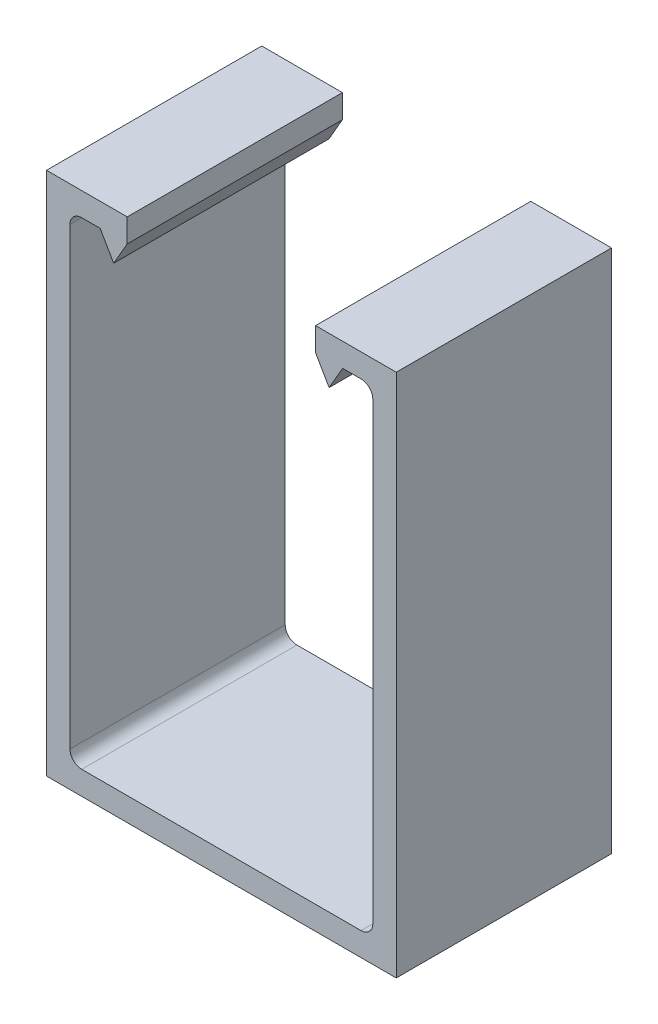
ISO-10303-21;
HEADER;
FILE_DESCRIPTION(('STEP AP214'),'2;1');
FILE_NAME('part.step','',(''),(''),'','','');
FILE_SCHEMA(('AUTOMOTIVE_DESIGN { 1 0 10303 214 1 1 1 1 }'));
ENDSEC;
DATA;
#1=APPLICATION_CONTEXT('core data for automotive mechanical design processes');
#2=APPLICATION_PROTOCOL_DEFINITION('international standard','automotive_design',2000,#1);
#3=PRODUCT_CONTEXT('',#1,'mechanical');
#4=PRODUCT('Part','Part','',(#3));
#5=PRODUCT_RELATED_PRODUCT_CATEGORY('part','',(#4));
#6=PRODUCT_DEFINITION_FORMATION('','',#4);
#7=PRODUCT_DEFINITION_CONTEXT('part definition',#1,'design');
#8=PRODUCT_DEFINITION('design','',#6,#7);
#9=PRODUCT_DEFINITION_SHAPE('','',#8);
#10=(LENGTH_UNIT() NAMED_UNIT(*) SI_UNIT(.MILLI.,.METRE.));
#11=(NAMED_UNIT(*) PLANE_ANGLE_UNIT() SI_UNIT($,.RADIAN.));
#12=(NAMED_UNIT(*) SI_UNIT($,.STERADIAN.) SOLID_ANGLE_UNIT());
#13=UNCERTAINTY_MEASURE_WITH_UNIT(LENGTH_MEASURE(1.E-05),#10,'distance_accuracy_value','');
#14=(GEOMETRIC_REPRESENTATION_CONTEXT(3) GLOBAL_UNCERTAINTY_ASSIGNED_CONTEXT((#13)) GLOBAL_UNIT_ASSIGNED_CONTEXT((#10,
#11,#12)) REPRESENTATION_CONTEXT('',''));
#15=CARTESIAN_POINT('',(0.,0.,0.));
#16=DIRECTION('',(0.,0.,1.));
#17=DIRECTION('',(1.,0.,0.));
#18=AXIS2_PLACEMENT_3D('',#15,#16,#17);
#19=CARTESIAN_POINT('',(-16.4846,-26.80335,12.7));
#20=DIRECTION('',(0.,0.,-1.));
#21=DIRECTION('',(-1.,0.,0.));
#22=AXIS2_PLACEMENT_3D('',#19,#20,#21);
#23=CYLINDRICAL_SURFACE('',#22,1.3843);
#24=CARTESIAN_POINT('',(-16.4846,-26.80335,-12.7));
#25=DIRECTION('',(0.,0.,-1.));
#26=DIRECTION('',(1.,0.,0.));
#27=AXIS2_PLACEMENT_3D('',#24,#25,#26);
#28=CIRCLE('',#27,1.3843);
#29=CARTESIAN_POINT('',(-16.4846,-28.18765,-12.7));
#30=VERTEX_POINT('',#29);
#31=CARTESIAN_POINT('',(-17.8689,-26.80335,-12.7));
#32=VERTEX_POINT('',#31);
#33=EDGE_CURVE('E200',#30,#32,#28,.T.);
#34=ORIENTED_EDGE('',*,*,#33,.T.);
#35=DIRECTION('',(0.,0.,-1.));
#36=VECTOR('',#35,1.);
#37=CARTESIAN_POINT('',(-17.8689,-26.80335,12.7));
#38=LINE('',#37,#36);
#39=CARTESIAN_POINT('',(-17.8689,-26.80335,12.7));
#40=VERTEX_POINT('',#39);
#41=EDGE_CURVE('E11',#40,#32,#38,.T.);
#42=ORIENTED_EDGE('',*,*,#41,.F.);
#43=CARTESIAN_POINT('',(-16.4846,-26.80335,12.7));
#44=DIRECTION('',(0.,0.,-1.));
#45=DIRECTION('',(1.,0.,0.));
#46=AXIS2_PLACEMENT_3D('',#43,#44,#45);
#47=CIRCLE('',#46,1.3843);
#48=CARTESIAN_POINT('',(-16.4846,-28.18765,12.7));
#49=VERTEX_POINT('',#48);
#50=EDGE_CURVE('E238',#49,#40,#47,.T.);
#51=ORIENTED_EDGE('',*,*,#50,.F.);
#52=DIRECTION('',(0.,0.,-1.));
#53=VECTOR('',#52,1.);
#54=CARTESIAN_POINT('',(-16.4846,-28.18765,12.7));
#55=LINE('',#54,#53);
#56=EDGE_CURVE('E196',#49,#30,#55,.T.);
#57=ORIENTED_EDGE('',*,*,#56,.T.);
#58=EDGE_LOOP('',(#34,#42,#51,#57));
#59=FACE_BOUND('',#58,.T.);
#60=ADVANCED_FACE('F32',(#59),#23,.F.);
#61=CARTESIAN_POINT('',(-17.8689,26.80335,12.7));
#62=DIRECTION('',(-1.,0.,0.));
#63=DIRECTION('',(0.,0.,1.));
#64=AXIS2_PLACEMENT_3D('',#61,#62,#63);
#65=PLANE('',#64);
#66=DIRECTION('',(0.,1.,0.));
#67=VECTOR('',#66,1.);
#68=CARTESIAN_POINT('',(-17.8689,26.80335,-12.7));
#69=LINE('',#68,#67);
#70=CARTESIAN_POINT('',(-17.8689,26.80335,-12.7));
#71=VERTEX_POINT('',#70);
#72=EDGE_CURVE('E203',#32,#71,#69,.T.);
#73=ORIENTED_EDGE('',*,*,#72,.T.);
#74=DIRECTION('',(0.,0.,-1.));
#75=VECTOR('',#74,1.);
#76=CARTESIAN_POINT('',(-17.8689,26.80335,12.7));
#77=LINE('',#76,#75);
#78=CARTESIAN_POINT('',(-17.8689,26.80335,12.7));
#79=VERTEX_POINT('',#78);
#80=EDGE_CURVE('E40',#79,#71,#77,.T.);
#81=ORIENTED_EDGE('',*,*,#80,.F.);
#82=DIRECTION('',(0.,1.,0.));
#83=VECTOR('',#82,1.);
#84=CARTESIAN_POINT('',(-17.8689,26.80335,12.7));
#85=LINE('',#84,#83);
#86=EDGE_CURVE('E127',#40,#79,#85,.T.);
#87=ORIENTED_EDGE('',*,*,#86,.F.);
#88=ORIENTED_EDGE('',*,*,#41,.T.);
#89=EDGE_LOOP('',(#73,#81,#87,#88));
#90=FACE_BOUND('',#89,.T.);
#91=ADVANCED_FACE('F356',(#90),#65,.F.);
#92=CARTESIAN_POINT('',(-16.4846,26.80335,12.7));
#93=DIRECTION('',(0.,0.,-1.));
#94=DIRECTION('',(-1.,0.,0.));
#95=AXIS2_PLACEMENT_3D('',#92,#93,#94);
#96=CYLINDRICAL_SURFACE('',#95,1.3843);
#97=CARTESIAN_POINT('',(-16.4846,26.80335,-12.7));
#98=DIRECTION('',(0.,0.,-1.));
#99=DIRECTION('',(1.,0.,0.));
#100=AXIS2_PLACEMENT_3D('',#97,#98,#99);
#101=CIRCLE('',#100,1.3843);
#102=CARTESIAN_POINT('',(-16.4846,28.18765,-12.7));
#103=VERTEX_POINT('',#102);
#104=EDGE_CURVE('E205',#71,#103,#101,.T.);
#105=ORIENTED_EDGE('',*,*,#104,.T.);
#106=DIRECTION('',(0.,0.,-1.));
#107=VECTOR('',#106,1.);
#108=CARTESIAN_POINT('',(-16.4846,28.18765,12.7));
#109=LINE('',#108,#107);
#110=CARTESIAN_POINT('',(-16.4846,28.18765,12.7));
#111=VERTEX_POINT('',#110);
#112=EDGE_CURVE('E281',#111,#103,#109,.T.);
#113=ORIENTED_EDGE('',*,*,#112,.F.);
#114=CARTESIAN_POINT('',(-16.4846,26.80335,12.7));
#115=DIRECTION('',(0.,0.,-1.));
#116=DIRECTION('',(1.,0.,0.));
#117=AXIS2_PLACEMENT_3D('',#114,#115,#116);
#118=CIRCLE('',#117,1.3843);
#119=EDGE_CURVE('E289',#79,#111,#118,.T.);
#120=ORIENTED_EDGE('',*,*,#119,.F.);
#121=ORIENTED_EDGE('',*,*,#80,.T.);
#122=EDGE_LOOP('',(#105,#113,#120,#121));
#123=FACE_BOUND('',#122,.T.);
#124=ADVANCED_FACE('F287',(#123),#96,.F.);
#125=CARTESIAN_POINT('',(-14.3094039105567,28.18765,12.7));
#126=DIRECTION('',(0.,1.,0.));
#127=DIRECTION('',(0.,0.,1.));
#128=AXIS2_PLACEMENT_3D('',#125,#126,#127);
#129=PLANE('',#128);
#130=DIRECTION('',(1.,0.,0.));
#131=VECTOR('',#130,1.);
#132=CARTESIAN_POINT('',(-14.3094039105567,28.18765,-12.7));
#133=LINE('',#132,#131);
#134=CARTESIAN_POINT('',(-14.3094039105567,28.18765,-12.7));
#135=VERTEX_POINT('',#134);
#136=EDGE_CURVE('E207',#103,#135,#133,.T.);
#137=ORIENTED_EDGE('',*,*,#136,.T.);
#138=DIRECTION('',(0.,0.,-1.));
#139=VECTOR('',#138,1.);
#140=CARTESIAN_POINT('',(-14.3094039105567,28.18765,12.7));
#141=LINE('',#140,#139);
#142=CARTESIAN_POINT('',(-14.3094039105567,28.18765,12.7));
#143=VERTEX_POINT('',#142);
#144=EDGE_CURVE('E278',#143,#135,#141,.T.);
#145=ORIENTED_EDGE('',*,*,#144,.F.);
#146=DIRECTION('',(1.,0.,0.));
#147=VECTOR('',#146,1.);
#148=CARTESIAN_POINT('',(-14.3094039105567,28.18765,12.7));
#149=LINE('',#148,#147);
#150=EDGE_CURVE('E307',#111,#143,#149,.T.);
#151=ORIENTED_EDGE('',*,*,#150,.F.);
#152=ORIENTED_EDGE('',*,*,#112,.T.);
#153=EDGE_LOOP('',(#137,#145,#151,#152));
#154=FACE_BOUND('',#153,.T.);
#155=ADVANCED_FACE('F298',(#154),#129,.F.);
#156=CARTESIAN_POINT('',(-14.3094039105567,28.18765,12.7));
#157=DIRECTION('',(0.866025404088336,0.499999999473635,0.));
#158=DIRECTION('',(-0.499999999473635,0.866025404088336,0.));
#159=AXIS2_PLACEMENT_3D('',#156,#157,#158);
#160=PLANE('',#159);
#161=DIRECTION('',(0.499999999473635,-0.866025404088336,0.));
#162=VECTOR('',#161,1.);
#163=CARTESIAN_POINT('',(-14.3094039105567,28.18765,-12.7));
#164=LINE('',#163,#162);
#165=CARTESIAN_POINT('',(-12.710951957522,25.41905,-12.7));
#166=VERTEX_POINT('',#165);
#167=EDGE_CURVE('E209',#135,#166,#164,.T.);
#168=ORIENTED_EDGE('',*,*,#167,.T.);
#169=DIRECTION('',(0.,0.,-1.));
#170=VECTOR('',#169,1.);
#171=CARTESIAN_POINT('',(-12.710951957522,25.41905,12.7));
#172=LINE('',#171,#170);
#173=CARTESIAN_POINT('',(-12.710951957522,25.41905,12.7));
#174=VERTEX_POINT('',#173);
#175=EDGE_CURVE('E275',#174,#166,#172,.T.);
#176=ORIENTED_EDGE('',*,*,#175,.F.);
#177=DIRECTION('',(0.499999999473635,-0.866025404088336,0.));
#178=VECTOR('',#177,1.);
#179=CARTESIAN_POINT('',(-14.3094039105567,28.18765,12.7));
#180=LINE('',#179,#178);
#181=EDGE_CURVE('E304',#143,#174,#180,.T.);
#182=ORIENTED_EDGE('',*,*,#181,.F.);
#183=ORIENTED_EDGE('',*,*,#144,.T.);
#184=EDGE_LOOP('',(#168,#176,#182,#183));
#185=FACE_BOUND('',#184,.T.);
#186=ADVANCED_FACE('F302',(#185),#160,.F.);
#187=CARTESIAN_POINT('',(-12.710951957522,25.41905,12.7));
#188=DIRECTION('',(-0.866025403480547,0.500000000526357,0.));
#189=DIRECTION('',(-0.500000000526357,-0.866025403480547,0.));
#190=AXIS2_PLACEMENT_3D('',#187,#188,#189);
#191=PLANE('',#190);
#192=DIRECTION('',(0.500000000526357,0.866025403480546,0.));
#193=VECTOR('',#192,1.);
#194=CARTESIAN_POINT('',(-12.710951957522,25.41905,-12.7));
#195=LINE('',#194,#193);
#196=CARTESIAN_POINT('',(-11.1125,28.18765,-12.7));
#197=VERTEX_POINT('',#196);
#198=EDGE_CURVE('E211',#166,#197,#195,.T.);
#199=ORIENTED_EDGE('',*,*,#198,.T.);
#200=DIRECTION('',(0.,0.,-1.));
#201=VECTOR('',#200,1.);
#202=CARTESIAN_POINT('',(-11.1125,28.18765,12.7));
#203=LINE('',#202,#201);
#204=CARTESIAN_POINT('',(-11.1125,28.18765,12.7));
#205=VERTEX_POINT('',#204);
#206=EDGE_CURVE('E272',#205,#197,#203,.T.);
#207=ORIENTED_EDGE('',*,*,#206,.F.);
#208=DIRECTION('',(0.500000000526357,0.866025403480546,0.));
#209=VECTOR('',#208,1.);
#210=CARTESIAN_POINT('',(-12.710951957522,25.41905,12.7));
#211=LINE('',#210,#209);
#212=EDGE_CURVE('E306',#174,#205,#211,.T.);
#213=ORIENTED_EDGE('',*,*,#212,.F.);
#214=ORIENTED_EDGE('',*,*,#175,.T.);
#215=EDGE_LOOP('',(#199,#207,#213,#214));
#216=FACE_BOUND('',#215,.T.);
#217=ADVANCED_FACE('F369',(#216),#191,.F.);
#218=CARTESIAN_POINT('',(-11.1125,28.18765,12.7));
#219=DIRECTION('',(-1.,0.,0.));
#220=DIRECTION('',(0.,-1.,0.));
#221=AXIS2_PLACEMENT_3D('',#218,#219,#220);
#222=PLANE('',#221);
#223=DIRECTION('',(0.,1.,0.));
#224=VECTOR('',#223,1.);
#225=CARTESIAN_POINT('',(-11.1125,28.18765,-12.7));
#226=LINE('',#225,#224);
#227=CARTESIAN_POINT('',(-11.1125,30.95625,-12.7));
#228=VERTEX_POINT('',#227);
#229=EDGE_CURVE('E213',#197,#228,#226,.T.);
#230=ORIENTED_EDGE('',*,*,#229,.T.);
#231=DIRECTION('',(0.,0.,-1.));
#232=VECTOR('',#231,1.);
#233=CARTESIAN_POINT('',(-11.1125,30.95625,12.7));
#234=LINE('',#233,#232);
#235=CARTESIAN_POINT('',(-11.1125,30.95625,12.7));
#236=VERTEX_POINT('',#235);
#237=EDGE_CURVE('E269',#236,#228,#234,.T.);
#238=ORIENTED_EDGE('',*,*,#237,.F.);
#239=DIRECTION('',(0.,1.,0.));
#240=VECTOR('',#239,1.);
#241=CARTESIAN_POINT('',(-11.1125,28.18765,12.7));
#242=LINE('',#241,#240);
#243=EDGE_CURVE('E309',#205,#236,#242,.T.);
#244=ORIENTED_EDGE('',*,*,#243,.F.);
#245=ORIENTED_EDGE('',*,*,#206,.T.);
#246=EDGE_LOOP('',(#230,#238,#244,#245));
#247=FACE_BOUND('',#246,.T.);
#248=ADVANCED_FACE('F372',(#247),#222,.F.);
#249=CARTESIAN_POINT('',(-11.1125,30.95625,12.7));
#250=DIRECTION('',(0.,-1.,0.));
#251=DIRECTION('',(0.,0.,-1.));
#252=AXIS2_PLACEMENT_3D('',#249,#250,#251);
#253=PLANE('',#252);
#254=DIRECTION('',(-1.,0.,0.));
#255=VECTOR('',#254,1.);
#256=CARTESIAN_POINT('',(-11.1125,30.95625,-12.7));
#257=LINE('',#256,#255);
#258=CARTESIAN_POINT('',(-20.6375,30.95625,-12.7));
#259=VERTEX_POINT('',#258);
#260=EDGE_CURVE('E215',#228,#259,#257,.T.);
#261=ORIENTED_EDGE('',*,*,#260,.T.);
#262=DIRECTION('',(0.,0.,-1.));
#263=VECTOR('',#262,1.);
#264=CARTESIAN_POINT('',(-20.6375,30.95625,12.7));
#265=LINE('',#264,#263);
#266=CARTESIAN_POINT('',(-20.6375,30.95625,12.7));
#267=VERTEX_POINT('',#266);
#268=EDGE_CURVE('E266',#267,#259,#265,.T.);
#269=ORIENTED_EDGE('',*,*,#268,.F.);
#270=DIRECTION('',(-1.,0.,0.));
#271=VECTOR('',#270,1.);
#272=CARTESIAN_POINT('',(-11.1125,30.95625,12.7));
#273=LINE('',#272,#271);
#274=EDGE_CURVE('E315',#236,#267,#273,.T.);
#275=ORIENTED_EDGE('',*,*,#274,.F.);
#276=ORIENTED_EDGE('',*,*,#237,.T.);
#277=EDGE_LOOP('',(#261,#269,#275,#276));
#278=FACE_BOUND('',#277,.T.);
#279=ADVANCED_FACE('F376',(#278),#253,.F.);
#280=CARTESIAN_POINT('',(-20.6375,30.95625,12.7));
#281=DIRECTION('',(1.,0.,0.));
#282=DIRECTION('',(0.,1.,0.));
#283=AXIS2_PLACEMENT_3D('',#280,#281,#282);
#284=PLANE('',#283);
#285=DIRECTION('',(0.,-1.,0.));
#286=VECTOR('',#285,1.);
#287=CARTESIAN_POINT('',(-20.6375,30.95625,-12.7));
#288=LINE('',#287,#286);
#289=CARTESIAN_POINT('',(-20.6375,-30.95625,-12.7));
#290=VERTEX_POINT('',#289);
#291=EDGE_CURVE('E217',#259,#290,#288,.T.);
#292=ORIENTED_EDGE('',*,*,#291,.T.);
#293=DIRECTION('',(0.,0.,-1.));
#294=VECTOR('',#293,1.);
#295=CARTESIAN_POINT('',(-20.6375,-30.95625,12.7));
#296=LINE('',#295,#294);
#297=CARTESIAN_POINT('',(-20.6375,-30.95625,12.7));
#298=VERTEX_POINT('',#297);
#299=EDGE_CURVE('E263',#298,#290,#296,.T.);
#300=ORIENTED_EDGE('',*,*,#299,.F.);
#301=DIRECTION('',(0.,-1.,0.));
#302=VECTOR('',#301,1.);
#303=CARTESIAN_POINT('',(-20.6375,30.95625,12.7));
#304=LINE('',#303,#302);
#305=EDGE_CURVE('E317',#267,#298,#304,.T.);
#306=ORIENTED_EDGE('',*,*,#305,.F.);
#307=ORIENTED_EDGE('',*,*,#268,.T.);
#308=EDGE_LOOP('',(#292,#300,#306,#307));
#309=FACE_BOUND('',#308,.T.);
#310=ADVANCED_FACE('F380',(#309),#284,.F.);
#311=CARTESIAN_POINT('',(-20.6375,-30.95625,12.7));
#312=DIRECTION('',(0.,1.,0.));
#313=DIRECTION('',(0.,0.,1.));
#314=AXIS2_PLACEMENT_3D('',#311,#312,#313);
#315=PLANE('',#314);
#316=DIRECTION('',(1.,0.,0.));
#317=VECTOR('',#316,1.);
#318=CARTESIAN_POINT('',(-20.6375,-30.95625,-12.7));
#319=LINE('',#318,#317);
#320=CARTESIAN_POINT('',(20.6375,-30.95625,-12.7));
#321=VERTEX_POINT('',#320);
#322=EDGE_CURVE('E219',#290,#321,#319,.T.);
#323=ORIENTED_EDGE('',*,*,#322,.T.);
#324=DIRECTION('',(0.,0.,-1.));
#325=VECTOR('',#324,1.);
#326=CARTESIAN_POINT('',(20.6375,-30.95625,12.7));
#327=LINE('',#326,#325);
#328=CARTESIAN_POINT('',(20.6375,-30.95625,12.7));
#329=VERTEX_POINT('',#328);
#330=EDGE_CURVE('E260',#329,#321,#327,.T.);
#331=ORIENTED_EDGE('',*,*,#330,.F.);
#332=DIRECTION('',(1.,0.,0.));
#333=VECTOR('',#332,1.);
#334=CARTESIAN_POINT('',(-20.6375,-30.95625,12.7));
#335=LINE('',#334,#333);
#336=EDGE_CURVE('E319',#298,#329,#335,.T.);
#337=ORIENTED_EDGE('',*,*,#336,.F.);
#338=ORIENTED_EDGE('',*,*,#299,.T.);
#339=EDGE_LOOP('',(#323,#331,#337,#338));
#340=FACE_BOUND('',#339,.T.);
#341=ADVANCED_FACE('F384',(#340),#315,.F.);
#342=CARTESIAN_POINT('',(20.6375,-30.95625,12.7));
#343=DIRECTION('',(-1.,0.,0.));
#344=DIRECTION('',(0.,0.,1.));
#345=AXIS2_PLACEMENT_3D('',#342,#343,#344);
#346=PLANE('',#345);
#347=DIRECTION('',(0.,1.,0.));
#348=VECTOR('',#347,1.);
#349=CARTESIAN_POINT('',(20.6375,-30.95625,-12.7));
#350=LINE('',#349,#348);
#351=CARTESIAN_POINT('',(20.6375,30.95625,-12.7));
#352=VERTEX_POINT('',#351);
#353=EDGE_CURVE('E221',#321,#352,#350,.T.);
#354=ORIENTED_EDGE('',*,*,#353,.T.);
#355=DIRECTION('',(0.,0.,-1.));
#356=VECTOR('',#355,1.);
#357=CARTESIAN_POINT('',(20.6375,30.95625,12.7));
#358=LINE('',#357,#356);
#359=CARTESIAN_POINT('',(20.6375,30.95625,12.7));
#360=VERTEX_POINT('',#359);
#361=EDGE_CURVE('E257',#360,#352,#358,.T.);
#362=ORIENTED_EDGE('',*,*,#361,.F.);
#363=DIRECTION('',(0.,1.,0.));
#364=VECTOR('',#363,1.);
#365=CARTESIAN_POINT('',(20.6375,-30.95625,12.7));
#366=LINE('',#365,#364);
#367=EDGE_CURVE('E321',#329,#360,#366,.T.);
#368=ORIENTED_EDGE('',*,*,#367,.F.);
#369=ORIENTED_EDGE('',*,*,#330,.T.);
#370=EDGE_LOOP('',(#354,#362,#368,#369));
#371=FACE_BOUND('',#370,.T.);
#372=ADVANCED_FACE('F388',(#371),#346,.F.);
#373=CARTESIAN_POINT('',(20.6375,30.95625,12.7));
#374=DIRECTION('',(0.,-1.,0.));
#375=DIRECTION('',(0.,0.,-1.));
#376=AXIS2_PLACEMENT_3D('',#373,#374,#375);
#377=PLANE('',#376);
#378=DIRECTION('',(-1.,0.,0.));
#379=VECTOR('',#378,1.);
#380=CARTESIAN_POINT('',(20.6375,30.95625,-12.7));
#381=LINE('',#380,#379);
#382=CARTESIAN_POINT('',(11.1125,30.95625,-12.7));
#383=VERTEX_POINT('',#382);
#384=EDGE_CURVE('E223',#352,#383,#381,.T.);
#385=ORIENTED_EDGE('',*,*,#384,.T.);
#386=DIRECTION('',(0.,0.,-1.));
#387=VECTOR('',#386,1.);
#388=CARTESIAN_POINT('',(11.1125,30.95625,12.7));
#389=LINE('',#388,#387);
#390=CARTESIAN_POINT('',(11.1125,30.95625,12.7));
#391=VERTEX_POINT('',#390);
#392=EDGE_CURVE('E254',#391,#383,#389,.T.);
#393=ORIENTED_EDGE('',*,*,#392,.F.);
#394=DIRECTION('',(-1.,0.,0.));
#395=VECTOR('',#394,1.);
#396=CARTESIAN_POINT('',(20.6375,30.95625,12.7));
#397=LINE('',#396,#395);
#398=EDGE_CURVE('E323',#360,#391,#397,.T.);
#399=ORIENTED_EDGE('',*,*,#398,.F.);
#400=ORIENTED_EDGE('',*,*,#361,.T.);
#401=EDGE_LOOP('',(#385,#393,#399,#400));
#402=FACE_BOUND('',#401,.T.);
#403=ADVANCED_FACE('F392',(#402),#377,.F.);
#404=CARTESIAN_POINT('',(11.1125,28.18765,12.7));
#405=DIRECTION('',(1.,0.,0.));
#406=DIRECTION('',(0.,0.,-1.));
#407=AXIS2_PLACEMENT_3D('',#404,#405,#406);
#408=PLANE('',#407);
#409=DIRECTION('',(0.,-1.,0.));
#410=VECTOR('',#409,1.);
#411=CARTESIAN_POINT('',(11.1125,28.18765,-12.7));
#412=LINE('',#411,#410);
#413=CARTESIAN_POINT('',(11.1125,28.18765,-12.7));
#414=VERTEX_POINT('',#413);
#415=EDGE_CURVE('E225',#383,#414,#412,.T.);
#416=ORIENTED_EDGE('',*,*,#415,.T.);
#417=DIRECTION('',(0.,0.,-1.));
#418=VECTOR('',#417,1.);
#419=CARTESIAN_POINT('',(11.1125,28.18765,12.7));
#420=LINE('',#419,#418);
#421=CARTESIAN_POINT('',(11.1125,28.18765,12.7));
#422=VERTEX_POINT('',#421);
#423=EDGE_CURVE('E251',#422,#414,#420,.T.);
#424=ORIENTED_EDGE('',*,*,#423,.F.);
#425=DIRECTION('',(0.,-1.,0.));
#426=VECTOR('',#425,1.);
#427=CARTESIAN_POINT('',(11.1125,28.18765,12.7));
#428=LINE('',#427,#426);
#429=EDGE_CURVE('E325',#391,#422,#428,.T.);
#430=ORIENTED_EDGE('',*,*,#429,.F.);
#431=ORIENTED_EDGE('',*,*,#392,.T.);
#432=EDGE_LOOP('',(#416,#424,#430,#431));
#433=FACE_BOUND('',#432,.T.);
#434=ADVANCED_FACE('F396',(#433),#408,.F.);
#435=CARTESIAN_POINT('',(12.710951957522,25.41905,12.7));
#436=DIRECTION('',(0.866025403480548,0.500000000526354,0.));
#437=DIRECTION('',(-0.500000000526354,0.866025403480548,0.));
#438=AXIS2_PLACEMENT_3D('',#435,#436,#437);
#439=PLANE('',#438);
#440=DIRECTION('',(0.500000000526354,-0.866025403480548,0.));
#441=VECTOR('',#440,1.);
#442=CARTESIAN_POINT('',(12.710951957522,25.41905,-12.7));
#443=LINE('',#442,#441);
#444=CARTESIAN_POINT('',(12.710951957522,25.41905,-12.7));
#445=VERTEX_POINT('',#444);
#446=EDGE_CURVE('E227',#414,#445,#443,.T.);
#447=ORIENTED_EDGE('',*,*,#446,.T.);
#448=DIRECTION('',(0.,0.,-1.));
#449=VECTOR('',#448,1.);
#450=CARTESIAN_POINT('',(12.710951957522,25.41905,12.7));
#451=LINE('',#450,#449);
#452=CARTESIAN_POINT('',(12.710951957522,25.41905,12.7));
#453=VERTEX_POINT('',#452);
#454=EDGE_CURVE('E248',#453,#445,#451,.T.);
#455=ORIENTED_EDGE('',*,*,#454,.F.);
#456=DIRECTION('',(0.500000000526354,-0.866025403480548,0.));
#457=VECTOR('',#456,1.);
#458=CARTESIAN_POINT('',(12.710951957522,25.41905,12.7));
#459=LINE('',#458,#457);
#460=EDGE_CURVE('E327',#422,#453,#459,.T.);
#461=ORIENTED_EDGE('',*,*,#460,.F.);
#462=ORIENTED_EDGE('',*,*,#423,.T.);
#463=EDGE_LOOP('',(#447,#455,#461,#462));
#464=FACE_BOUND('',#463,.T.);
#465=ADVANCED_FACE('F400',(#464),#439,.F.);
#466=CARTESIAN_POINT('',(14.3094039105568,28.18765,12.7));
#467=DIRECTION('',(-0.866025404088332,0.499999999473642,0.));
#468=DIRECTION('',(-0.499999999473642,-0.866025404088332,0.));
#469=AXIS2_PLACEMENT_3D('',#466,#467,#468);
#470=PLANE('',#469);
#471=DIRECTION('',(0.499999999473642,0.866025404088331,0.));
#472=VECTOR('',#471,1.);
#473=CARTESIAN_POINT('',(14.3094039105568,28.18765,-12.7));
#474=LINE('',#473,#472);
#475=CARTESIAN_POINT('',(14.3094039105568,28.18765,-12.7));
#476=VERTEX_POINT('',#475);
#477=EDGE_CURVE('E229',#445,#476,#474,.T.);
#478=ORIENTED_EDGE('',*,*,#477,.T.);
#479=DIRECTION('',(0.,0.,-1.));
#480=VECTOR('',#479,1.);
#481=CARTESIAN_POINT('',(14.3094039105568,28.18765,12.7));
#482=LINE('',#481,#480);
#483=CARTESIAN_POINT('',(14.3094039105568,28.18765,12.7));
#484=VERTEX_POINT('',#483);
#485=EDGE_CURVE('E245',#484,#476,#482,.T.);
#486=ORIENTED_EDGE('',*,*,#485,.F.);
#487=DIRECTION('',(0.499999999473642,0.866025404088331,0.));
#488=VECTOR('',#487,1.);
#489=CARTESIAN_POINT('',(14.3094039105568,28.18765,12.7));
#490=LINE('',#489,#488);
#491=EDGE_CURVE('E329',#453,#484,#490,.T.);
#492=ORIENTED_EDGE('',*,*,#491,.F.);
#493=ORIENTED_EDGE('',*,*,#454,.T.);
#494=EDGE_LOOP('',(#478,#486,#492,#493));
#495=FACE_BOUND('',#494,.T.);
#496=ADVANCED_FACE('F404',(#495),#470,.F.);
#497=CARTESIAN_POINT('',(16.4846,28.18765,12.7));
#498=DIRECTION('',(0.,1.,0.));
#499=DIRECTION('',(0.,0.,1.));
#500=AXIS2_PLACEMENT_3D('',#497,#498,#499);
#501=PLANE('',#500);
#502=DIRECTION('',(1.,0.,0.));
#503=VECTOR('',#502,1.);
#504=CARTESIAN_POINT('',(16.4846,28.18765,-12.7));
#505=LINE('',#504,#503);
#506=CARTESIAN_POINT('',(16.4846,28.18765,-12.7));
#507=VERTEX_POINT('',#506);
#508=EDGE_CURVE('E231',#476,#507,#505,.T.);
#509=ORIENTED_EDGE('',*,*,#508,.T.);
#510=DIRECTION('',(0.,0.,-1.));
#511=VECTOR('',#510,1.);
#512=CARTESIAN_POINT('',(16.4846,28.18765,12.7));
#513=LINE('',#512,#511);
#514=CARTESIAN_POINT('',(16.4846,28.18765,12.7));
#515=VERTEX_POINT('',#514);
#516=EDGE_CURVE('E242',#515,#507,#513,.T.);
#517=ORIENTED_EDGE('',*,*,#516,.F.);
#518=DIRECTION('',(1.,0.,0.));
#519=VECTOR('',#518,1.);
#520=CARTESIAN_POINT('',(16.4846,28.18765,12.7));
#521=LINE('',#520,#519);
#522=EDGE_CURVE('E331',#484,#515,#521,.T.);
#523=ORIENTED_EDGE('',*,*,#522,.F.);
#524=ORIENTED_EDGE('',*,*,#485,.T.);
#525=EDGE_LOOP('',(#509,#517,#523,#524));
#526=FACE_BOUND('',#525,.T.);
#527=ADVANCED_FACE('F337',(#526),#501,.F.);
#528=CARTESIAN_POINT('',(16.4846,26.80335,12.7));
#529=DIRECTION('',(0.,0.,-1.));
#530=DIRECTION('',(-1.,0.,0.));
#531=AXIS2_PLACEMENT_3D('',#528,#529,#530);
#532=CYLINDRICAL_SURFACE('',#531,1.3843);
#533=CARTESIAN_POINT('',(16.4846,26.80335,-12.7));
#534=DIRECTION('',(0.,0.,-1.));
#535=DIRECTION('',(1.,0.,0.));
#536=AXIS2_PLACEMENT_3D('',#533,#534,#535);
#537=CIRCLE('',#536,1.3843);
#538=CARTESIAN_POINT('',(17.8689,26.80335,-12.7));
#539=VERTEX_POINT('',#538);
#540=EDGE_CURVE('E233',#507,#539,#537,.T.);
#541=ORIENTED_EDGE('',*,*,#540,.T.);
#542=DIRECTION('',(0.,0.,-1.));
#543=VECTOR('',#542,1.);
#544=CARTESIAN_POINT('',(17.8689,26.80335,12.7));
#545=LINE('',#544,#543);
#546=CARTESIAN_POINT('',(17.8689,26.80335,12.7));
#547=VERTEX_POINT('',#546);
#548=EDGE_CURVE('E191',#547,#539,#545,.T.);
#549=ORIENTED_EDGE('',*,*,#548,.F.);
#550=CARTESIAN_POINT('',(16.4846,26.80335,12.7));
#551=DIRECTION('',(0.,0.,-1.));
#552=DIRECTION('',(1.,0.,0.));
#553=AXIS2_PLACEMENT_3D('',#550,#551,#552);
#554=CIRCLE('',#553,1.3843);
#555=EDGE_CURVE('E182',#515,#547,#554,.T.);
#556=ORIENTED_EDGE('',*,*,#555,.F.);
#557=ORIENTED_EDGE('',*,*,#516,.T.);
#558=EDGE_LOOP('',(#541,#549,#556,#557));
#559=FACE_BOUND('',#558,.T.);
#560=ADVANCED_FACE('F341',(#559),#532,.F.);
#561=CARTESIAN_POINT('',(17.8689,-26.80335,12.7));
#562=DIRECTION('',(1.,0.,0.));
#563=DIRECTION('',(0.,0.,-1.));
#564=AXIS2_PLACEMENT_3D('',#561,#562,#563);
#565=PLANE('',#564);
#566=DIRECTION('',(0.,-1.,0.));
#567=VECTOR('',#566,1.);
#568=CARTESIAN_POINT('',(17.8689,-26.80335,-12.7));
#569=LINE('',#568,#567);
#570=CARTESIAN_POINT('',(17.8689,-26.80335,-12.7));
#571=VERTEX_POINT('',#570);
#572=EDGE_CURVE('E190',#539,#571,#569,.T.);
#573=ORIENTED_EDGE('',*,*,#572,.T.);
#574=DIRECTION('',(0.,0.,-1.));
#575=VECTOR('',#574,1.);
#576=CARTESIAN_POINT('',(17.8689,-26.80335,12.7));
#577=LINE('',#576,#575);
#578=CARTESIAN_POINT('',(17.8689,-26.80335,12.7));
#579=VERTEX_POINT('',#578);
#580=EDGE_CURVE('E187',#579,#571,#577,.T.);
#581=ORIENTED_EDGE('',*,*,#580,.F.);
#582=DIRECTION('',(0.,-1.,0.));
#583=VECTOR('',#582,1.);
#584=CARTESIAN_POINT('',(17.8689,-26.80335,12.7));
#585=LINE('',#584,#583);
#586=EDGE_CURVE('E176',#547,#579,#585,.T.);
#587=ORIENTED_EDGE('',*,*,#586,.F.);
#588=ORIENTED_EDGE('',*,*,#548,.T.);
#589=EDGE_LOOP('',(#573,#581,#587,#588));
#590=FACE_BOUND('',#589,.T.);
#591=ADVANCED_FACE('F188',(#590),#565,.F.);
#592=CARTESIAN_POINT('',(16.4846,-26.80335,12.7));
#593=DIRECTION('',(0.,0.,-1.));
#594=DIRECTION('',(-1.,0.,0.));
#595=AXIS2_PLACEMENT_3D('',#592,#593,#594);
#596=CYLINDRICAL_SURFACE('',#595,1.3843);
#597=CARTESIAN_POINT('',(16.4846,-26.80335,-12.7));
#598=DIRECTION('',(0.,0.,-1.));
#599=DIRECTION('',(1.,0.,0.));
#600=AXIS2_PLACEMENT_3D('',#597,#598,#599);
#601=CIRCLE('',#600,1.3843);
#602=CARTESIAN_POINT('',(16.4846,-28.18765,-12.7));
#603=VERTEX_POINT('',#602);
#604=EDGE_CURVE('E113',#571,#603,#601,.T.);
#605=ORIENTED_EDGE('',*,*,#604,.T.);
#606=DIRECTION('',(0.,0.,-1.));
#607=VECTOR('',#606,1.);
#608=CARTESIAN_POINT('',(16.4846,-28.18765,12.7));
#609=LINE('',#608,#607);
#610=CARTESIAN_POINT('',(16.4846,-28.18765,12.7));
#611=VERTEX_POINT('',#610);
#612=EDGE_CURVE('E192',#611,#603,#609,.T.);
#613=ORIENTED_EDGE('',*,*,#612,.F.);
#614=CARTESIAN_POINT('',(16.4846,-26.80335,12.7));
#615=DIRECTION('',(0.,0.,-1.));
#616=DIRECTION('',(1.,0.,0.));
#617=AXIS2_PLACEMENT_3D('',#614,#615,#616);
#618=CIRCLE('',#617,1.3843);
#619=EDGE_CURVE('E180',#579,#611,#618,.T.);
#620=ORIENTED_EDGE('',*,*,#619,.F.);
#621=ORIENTED_EDGE('',*,*,#580,.T.);
#622=EDGE_LOOP('',(#605,#613,#620,#621));
#623=FACE_BOUND('',#622,.T.);
#624=ADVANCED_FACE('F194',(#623),#596,.F.);
#625=CARTESIAN_POINT('',(-16.4846,-28.18765,12.7));
#626=DIRECTION('',(0.,-1.,0.));
#627=DIRECTION('',(0.,0.,-1.));
#628=AXIS2_PLACEMENT_3D('',#625,#626,#627);
#629=PLANE('',#628);
#630=DIRECTION('',(-1.,0.,0.));
#631=VECTOR('',#630,1.);
#632=CARTESIAN_POINT('',(-16.4846,-28.18765,-12.7));
#633=LINE('',#632,#631);
#634=EDGE_CURVE('E119',#603,#30,#633,.T.);
#635=ORIENTED_EDGE('',*,*,#634,.T.);
#636=ORIENTED_EDGE('',*,*,#56,.F.);
#637=DIRECTION('',(-1.,0.,0.));
#638=VECTOR('',#637,1.);
#639=CARTESIAN_POINT('',(-16.4846,-28.18765,12.7));
#640=LINE('',#639,#638);
#641=EDGE_CURVE('E48',#611,#49,#640,.T.);
#642=ORIENTED_EDGE('',*,*,#641,.F.);
#643=ORIENTED_EDGE('',*,*,#612,.T.);
#644=EDGE_LOOP('',(#635,#636,#642,#643));
#645=FACE_BOUND('',#644,.T.);
#646=ADVANCED_FACE('F345',(#645),#629,.F.);
#647=CARTESIAN_POINT('',(-16.4846,-26.80335,12.7));
#648=DIRECTION('',(0.,0.,1.));
#649=DIRECTION('',(1.,0.,0.));
#650=AXIS2_PLACEMENT_3D('',#647,#648,#649);
#651=PLANE('',#650);
#652=ORIENTED_EDGE('',*,*,#50,.T.);
#653=ORIENTED_EDGE('',*,*,#86,.T.);
#654=ORIENTED_EDGE('',*,*,#119,.T.);
#655=ORIENTED_EDGE('',*,*,#150,.T.);
#656=ORIENTED_EDGE('',*,*,#181,.T.);
#657=ORIENTED_EDGE('',*,*,#212,.T.);
#658=ORIENTED_EDGE('',*,*,#243,.T.);
#659=ORIENTED_EDGE('',*,*,#274,.T.);
#660=ORIENTED_EDGE('',*,*,#305,.T.);
#661=ORIENTED_EDGE('',*,*,#336,.T.);
#662=ORIENTED_EDGE('',*,*,#367,.T.);
#663=ORIENTED_EDGE('',*,*,#398,.T.);
#664=ORIENTED_EDGE('',*,*,#429,.T.);
#665=ORIENTED_EDGE('',*,*,#460,.T.);
#666=ORIENTED_EDGE('',*,*,#491,.T.);
#667=ORIENTED_EDGE('',*,*,#522,.T.);
#668=ORIENTED_EDGE('',*,*,#555,.T.);
#669=ORIENTED_EDGE('',*,*,#586,.T.);
#670=ORIENTED_EDGE('',*,*,#619,.T.);
#671=ORIENTED_EDGE('',*,*,#641,.T.);
#672=EDGE_LOOP('',(#652,#653,#654,#655,#656,#657,#658,#659,#660,#661,#662,#663,#664,#665,#666,
#667,#668,#669,#670,#671));
#673=FACE_BOUND('',#672,.T.);
#674=ADVANCED_FACE('F178',(#673),#651,.T.);
#675=CARTESIAN_POINT('',(-16.4846,-26.80335,-12.7));
#676=DIRECTION('',(0.,0.,1.));
#677=DIRECTION('',(1.,0.,0.));
#678=AXIS2_PLACEMENT_3D('',#675,#676,#677);
#679=PLANE('',#678);
#680=ORIENTED_EDGE('',*,*,#33,.F.);
#681=ORIENTED_EDGE('',*,*,#634,.F.);
#682=ORIENTED_EDGE('',*,*,#604,.F.);
#683=ORIENTED_EDGE('',*,*,#572,.F.);
#684=ORIENTED_EDGE('',*,*,#540,.F.);
#685=ORIENTED_EDGE('',*,*,#508,.F.);
#686=ORIENTED_EDGE('',*,*,#477,.F.);
#687=ORIENTED_EDGE('',*,*,#446,.F.);
#688=ORIENTED_EDGE('',*,*,#415,.F.);
#689=ORIENTED_EDGE('',*,*,#384,.F.);
#690=ORIENTED_EDGE('',*,*,#353,.F.);
#691=ORIENTED_EDGE('',*,*,#322,.F.);
#692=ORIENTED_EDGE('',*,*,#291,.F.);
#693=ORIENTED_EDGE('',*,*,#260,.F.);
#694=ORIENTED_EDGE('',*,*,#229,.F.);
#695=ORIENTED_EDGE('',*,*,#198,.F.);
#696=ORIENTED_EDGE('',*,*,#167,.F.);
#697=ORIENTED_EDGE('',*,*,#136,.F.);
#698=ORIENTED_EDGE('',*,*,#104,.F.);
#699=ORIENTED_EDGE('',*,*,#72,.F.);
#700=EDGE_LOOP('',(#680,#681,#682,#683,#684,#685,#686,#687,#688,#689,#690,#691,#692,#693,#694,
#695,#696,#697,#698,#699));
#701=FACE_BOUND('',#700,.T.);
#702=ADVANCED_FACE('F293',(#701),#679,.F.);
#703=CLOSED_SHELL('',(#60,#91,#124,#155,#186,#217,#248,#279,#310,#341,#372,#403,#434,#465,#496,
#527,#560,#591,#624,#646,#674,#702));
#704=MANIFOLD_SOLID_BREP('B2',#703);
#705=ADVANCED_BREP_SHAPE_REPRESENTATION('',(#18,#704),#14);
#706=SHAPE_DEFINITION_REPRESENTATION(#9,#705);
ENDSEC;
END-ISO-10303-21;
